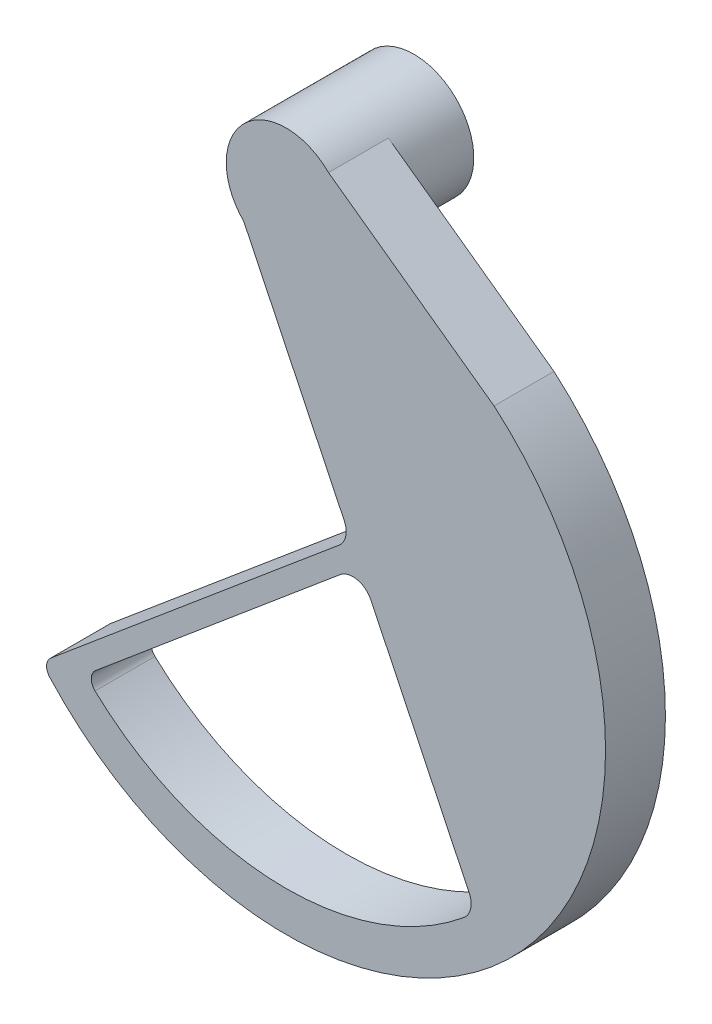
ISO-10303-21;
HEADER;
FILE_DESCRIPTION(('STEP AP214'),'2;1');
FILE_NAME('part.step','',(''),(''),'','','');
FILE_SCHEMA(('AUTOMOTIVE_DESIGN { 1 0 10303 214 1 1 1 1 }'));
ENDSEC;
DATA;
#1=APPLICATION_CONTEXT('core data for automotive mechanical design processes');
#2=APPLICATION_PROTOCOL_DEFINITION('international standard','automotive_design',2000,#1);
#3=PRODUCT_CONTEXT('',#1,'mechanical');
#4=PRODUCT('Part','Part','',(#3));
#5=PRODUCT_RELATED_PRODUCT_CATEGORY('part','',(#4));
#6=PRODUCT_DEFINITION_FORMATION('','',#4);
#7=PRODUCT_DEFINITION_CONTEXT('part definition',#1,'design');
#8=PRODUCT_DEFINITION('design','',#6,#7);
#9=PRODUCT_DEFINITION_SHAPE('','',#8);
#10=(LENGTH_UNIT() NAMED_UNIT(*) SI_UNIT(.MILLI.,.METRE.));
#11=(NAMED_UNIT(*) PLANE_ANGLE_UNIT() SI_UNIT($,.RADIAN.));
#12=(NAMED_UNIT(*) SI_UNIT($,.STERADIAN.) SOLID_ANGLE_UNIT());
#13=UNCERTAINTY_MEASURE_WITH_UNIT(LENGTH_MEASURE(1.E-05),#10,'distance_accuracy_value','');
#14=(GEOMETRIC_REPRESENTATION_CONTEXT(3) GLOBAL_UNCERTAINTY_ASSIGNED_CONTEXT((#13)) GLOBAL_UNIT_ASSIGNED_CONTEXT((#10,
#11,#12)) REPRESENTATION_CONTEXT('',''));
#15=CARTESIAN_POINT('',(0.,0.,0.));
#16=DIRECTION('',(0.,0.,1.));
#17=DIRECTION('',(1.,0.,0.));
#18=AXIS2_PLACEMENT_3D('',#15,#16,#17);
#19=CARTESIAN_POINT('',(0.,0.,0.));
#20=DIRECTION('',(0.,0.,1.));
#21=DIRECTION('',(1.,0.,0.));
#22=AXIS2_PLACEMENT_3D('',#19,#20,#21);
#23=PLANE('',#22);
#24=DIRECTION('',(0.433389731511241,-0.901206602628173,0.));
#25=VECTOR('',#24,1.);
#26=CARTESIAN_POINT('',(-12.7570586950624,-6.1348621133076,0.));
#27=LINE('',#26,#25);
#28=CARTESIAN_POINT('',(21.2324006956412,-76.8137984043253,0.));
#29=VERTEX_POINT('',#28);
#30=CARTESIAN_POINT('',(45.844843506453,-127.9938203457,0.));
#31=VERTEX_POINT('',#30);
#32=EDGE_CURVE('E180',#29,#31,#27,.T.);
#33=ORIENTED_EDGE('',*,*,#32,.F.);
#34=CARTESIAN_POINT('',(16.7263676825004,-78.9807470618814,0.));
#35=DIRECTION('',(0.,0.,1.));
#36=DIRECTION('',(1.,0.,0.));
#37=AXIS2_PLACEMENT_3D('',#34,#35,#36);
#38=CIRCLE('',#37,5.);
#39=CARTESIAN_POINT('',(13.5112294647628,-75.1515322284145,0.));
#40=VERTEX_POINT('',#39);
#41=EDGE_CURVE('E104',#40,#29,#38,.F.);
#42=ORIENTED_EDGE('',*,*,#41,.F.);
#43=DIRECTION('',(0.765842966693394,0.643027643547508,0.));
#44=VECTOR('',#43,1.);
#45=CARTESIAN_POINT('',(42.5956727933285,-50.7312504333006,0.));
#46=LINE('',#45,#44);
#47=CARTESIAN_POINT('',(-47.7476784165524,-126.586582094174,0.));
#48=VERTEX_POINT('',#47);
#49=EDGE_CURVE('E98',#48,#40,#46,.T.);
#50=ORIENTED_EDGE('',*,*,#49,.F.);
#51=CARTESIAN_POINT('',(-45.8185954859101,-128.884110994254,0.));
#52=DIRECTION('',(0.,0.,1.));
#53=DIRECTION('',(1.,0.,0.));
#54=AXIS2_PLACEMENT_3D('',#51,#52,#53);
#55=CIRCLE('',#54,2.99999999999979);
#56=CARTESIAN_POINT('',(-47.870174388264,-131.072951785042,0.));
#57=VERTEX_POINT('',#56);
#58=EDGE_CURVE('E156',#57,#48,#55,.F.);
#59=ORIENTED_EDGE('',*,*,#58,.F.);
#60=CARTESIAN_POINT('',(0.,-80.,0.));
#61=DIRECTION('',(0.,0.,1.));
#62=DIRECTION('',(1.,0.,0.));
#63=AXIS2_PLACEMENT_3D('',#60,#61,#62);
#64=CIRCLE('',#63,70.);
#65=CARTESIAN_POINT('',(44.5187189927976,-134.019289695814,0.));
#66=VERTEX_POINT('',#65);
#67=EDGE_CURVE('E187',#57,#66,#64,.T.);
#68=ORIENTED_EDGE('',*,*,#67,.T.);
#69=CARTESIAN_POINT('',(41.3388104933121,-130.160769003256,0.));
#70=DIRECTION('',(0.,0.,1.));
#71=DIRECTION('',(1.,0.,0.));
#72=AXIS2_PLACEMENT_3D('',#69,#70,#71);
#73=CIRCLE('',#72,4.99999999999999);
#74=EDGE_CURVE('E183',#31,#66,#73,.F.);
#75=ORIENTED_EDGE('',*,*,#74,.F.);
#76=EDGE_LOOP('',(#33,#42,#50,#59,#68,#75));
#77=FACE_BOUND('',#76,.T.);
#78=CARTESIAN_POINT('',(0.,0.,0.));
#79=DIRECTION('',(0.,0.,-1.));
#80=DIRECTION('',(-1.,0.,0.));
#81=AXIS2_PLACEMENT_3D('',#78,#79,#80);
#82=CIRCLE('',#81,15.);
#83=CARTESIAN_POINT('',(10.6066017177981,10.6066017177983,0.));
#84=VERTEX_POINT('',#83);
#85=CARTESIAN_POINT('',(-10.6066017177981,-10.6066017177983,0.));
#86=VERTEX_POINT('',#85);
#87=EDGE_CURVE('E213',#84,#86,#82,.T.);
#88=ORIENTED_EDGE('',*,*,#87,.F.);
#89=DIRECTION('',(0.811357931424902,-0.584549661802916,0.));
#90=VECTOR('',#89,1.);
#91=CARTESIAN_POINT('',(8.65474635415258,12.0128323695447,0.));
#92=LINE('',#91,#90);
#93=CARTESIAN_POINT('',(52.0761789176771,-19.2705047828151,0.));
#94=VERTEX_POINT('',#93);
#95=EDGE_CURVE('E179',#84,#94,#92,.T.);
#96=ORIENTED_EDGE('',*,*,#95,.T.);
#97=CARTESIAN_POINT('',(0.,-80.,0.));
#98=DIRECTION('',(0.,0.,1.));
#99=DIRECTION('',(1.,0.,0.));
#100=AXIS2_PLACEMENT_3D('',#97,#98,#99);
#101=CIRCLE('',#100,80.);
#102=CARTESIAN_POINT('',(-59.2335308651964,-133.771635843089,0.));
#103=VERTEX_POINT('',#102);
#104=EDGE_CURVE('E176',#103,#94,#101,.T.);
#105=ORIENTED_EDGE('',*,*,#104,.F.);
#106=CARTESIAN_POINT('',(-57.0122734577518,-131.755199498973,0.));
#107=DIRECTION('',(0.,0.,1.));
#108=DIRECTION('',(1.,0.,0.));
#109=AXIS2_PLACEMENT_3D('',#106,#107,#108);
#110=CIRCLE('',#109,2.99999999999976);
#111=CARTESIAN_POINT('',(-58.9406362868111,-129.457066169617,0.));
#112=VERTEX_POINT('',#111);
#113=EDGE_CURVE('E173',#103,#112,#110,.F.);
#114=ORIENTED_EDGE('',*,*,#113,.T.);
#115=DIRECTION('',(0.766044443118982,0.642787609686534,0.));
#116=VECTOR('',#115,1.);
#117=CARTESIAN_POINT('',(39.3923101204882,-46.9459271066778,0.));
#118=LINE('',#117,#116);
#119=CARTESIAN_POINT('',(13.2441851892925,-68.8868090924212,0.));
#120=VERTEX_POINT('',#119);
#121=EDGE_CURVE('E169',#112,#120,#118,.T.);
#122=ORIENTED_EDGE('',*,*,#121,.T.);
#123=CARTESIAN_POINT('',(10.0302471408598,-65.0565868768263,0.));
#124=DIRECTION('',(0.,0.,1.));
#125=DIRECTION('',(1.,0.,0.));
#126=AXIS2_PLACEMENT_3D('',#123,#124,#125);
#127=CIRCLE('',#126,5.);
#128=CARTESIAN_POINT('',(14.5362801540007,-62.8896382192701,0.));
#129=VERTEX_POINT('',#128);
#130=EDGE_CURVE('E166',#120,#129,#127,.T.);
#131=ORIENTED_EDGE('',*,*,#130,.T.);
#132=DIRECTION('',(0.433389731511242,-0.901206602628173,0.));
#133=VECTOR('',#132,1.);
#134=CARTESIAN_POINT('',(-12.7570586950624,-6.13486211330761,0.));
#135=LINE('',#134,#133);
#136=EDGE_CURVE('E184',#86,#129,#135,.T.);
#137=ORIENTED_EDGE('',*,*,#136,.F.);
#138=EDGE_LOOP('',(#88,#96,#105,#114,#122,#131,#137));
#139=FACE_BOUND('',#138,.T.);
#140=ADVANCED_FACE('F37',(#77,#139),#23,.F.);
#141=CARTESIAN_POINT('',(-12.7570586950624,-6.1348621133076,15.));
#142=DIRECTION('',(0.901206602628173,0.433389731511241,0.));
#143=DIRECTION('',(-0.433389731511241,0.901206602628173,0.));
#144=AXIS2_PLACEMENT_3D('',#141,#142,#143);
#145=PLANE('',#144);
#146=ORIENTED_EDGE('',*,*,#32,.T.);
#147=DIRECTION('',(0.,0.,-1.));
#148=VECTOR('',#147,1.);
#149=CARTESIAN_POINT('',(45.844843506453,-127.9938203457,15.));
#150=LINE('',#149,#148);
#151=CARTESIAN_POINT('',(45.844843506453,-127.9938203457,15.));
#152=VERTEX_POINT('',#151);
#153=EDGE_CURVE('E11',#152,#31,#150,.T.);
#154=ORIENTED_EDGE('',*,*,#153,.F.);
#155=DIRECTION('',(0.433389731511241,-0.901206602628173,0.));
#156=VECTOR('',#155,1.);
#157=CARTESIAN_POINT('',(-12.7570586950624,-6.1348621133076,15.));
#158=LINE('',#157,#156);
#159=CARTESIAN_POINT('',(21.2324006956412,-76.8137984043253,15.));
#160=VERTEX_POINT('',#159);
#161=EDGE_CURVE('E234',#160,#152,#158,.T.);
#162=ORIENTED_EDGE('',*,*,#161,.F.);
#163=DIRECTION('',(0.,0.,-1.));
#164=VECTOR('',#163,1.);
#165=CARTESIAN_POINT('',(21.2324006956412,-76.8137984043253,15.));
#166=LINE('',#165,#164);
#167=EDGE_CURVE('E194',#160,#29,#166,.T.);
#168=ORIENTED_EDGE('',*,*,#167,.T.);
#169=EDGE_LOOP('',(#146,#154,#162,#168));
#170=FACE_BOUND('',#169,.T.);
#171=ADVANCED_FACE('F246',(#170),#145,.F.);
#172=CARTESIAN_POINT('',(41.3388104933121,-130.160769003256,15.));
#173=DIRECTION('',(0.,0.,-1.));
#174=DIRECTION('',(-1.,0.,0.));
#175=AXIS2_PLACEMENT_3D('',#172,#173,#174);
#176=CYLINDRICAL_SURFACE('',#175,4.99999999999999);
#177=ORIENTED_EDGE('',*,*,#74,.T.);
#178=DIRECTION('',(0.,0.,-1.));
#179=VECTOR('',#178,1.);
#180=CARTESIAN_POINT('',(44.5187189927976,-134.019289695814,15.));
#181=LINE('',#180,#179);
#182=CARTESIAN_POINT('',(44.5187189927976,-134.019289695814,15.));
#183=VERTEX_POINT('',#182);
#184=EDGE_CURVE('E47',#183,#66,#181,.T.);
#185=ORIENTED_EDGE('',*,*,#184,.F.);
#186=CARTESIAN_POINT('',(41.3388104933121,-130.160769003256,15.));
#187=DIRECTION('',(0.,0.,1.));
#188=DIRECTION('',(1.,0.,0.));
#189=AXIS2_PLACEMENT_3D('',#186,#187,#188);
#190=CIRCLE('',#189,4.99999999999999);
#191=EDGE_CURVE('E236',#152,#183,#190,.F.);
#192=ORIENTED_EDGE('',*,*,#191,.F.);
#193=ORIENTED_EDGE('',*,*,#153,.T.);
#194=EDGE_LOOP('',(#177,#185,#192,#193));
#195=FACE_BOUND('',#194,.T.);
#196=ADVANCED_FACE('F268',(#195),#176,.F.);
#197=CARTESIAN_POINT('',(0.,-80.,15.));
#198=DIRECTION('',(0.,0.,-1.));
#199=DIRECTION('',(-1.,0.,0.));
#200=AXIS2_PLACEMENT_3D('',#197,#198,#199);
#201=CYLINDRICAL_SURFACE('',#200,70.);
#202=ORIENTED_EDGE('',*,*,#67,.F.);
#203=DIRECTION('',(0.,0.,-1.));
#204=VECTOR('',#203,1.);
#205=CARTESIAN_POINT('',(-47.870174388264,-131.072951785042,15.));
#206=LINE('',#205,#204);
#207=CARTESIAN_POINT('',(-47.870174388264,-131.072951785042,15.));
#208=VERTEX_POINT('',#207);
#209=EDGE_CURVE('E157',#208,#57,#206,.T.);
#210=ORIENTED_EDGE('',*,*,#209,.F.);
#211=CARTESIAN_POINT('',(0.,-80.,15.));
#212=DIRECTION('',(0.,0.,1.));
#213=DIRECTION('',(1.,0.,0.));
#214=AXIS2_PLACEMENT_3D('',#211,#212,#213);
#215=CIRCLE('',#214,70.);
#216=EDGE_CURVE('E150',#208,#183,#215,.T.);
#217=ORIENTED_EDGE('',*,*,#216,.T.);
#218=ORIENTED_EDGE('',*,*,#184,.T.);
#219=EDGE_LOOP('',(#202,#210,#217,#218));
#220=FACE_BOUND('',#219,.T.);
#221=ADVANCED_FACE('F239',(#220),#201,.F.);
#222=CARTESIAN_POINT('',(-45.8185954859101,-128.884110994254,15.));
#223=DIRECTION('',(0.,0.,-1.));
#224=DIRECTION('',(-1.,0.,0.));
#225=AXIS2_PLACEMENT_3D('',#222,#223,#224);
#226=CYLINDRICAL_SURFACE('',#225,2.99999999999979);
#227=ORIENTED_EDGE('',*,*,#58,.T.);
#228=DIRECTION('',(0.,0.,-1.));
#229=VECTOR('',#228,1.);
#230=CARTESIAN_POINT('',(-47.7476784165524,-126.586582094174,15.));
#231=LINE('',#230,#229);
#232=CARTESIAN_POINT('',(-47.7476784165524,-126.586582094174,15.));
#233=VERTEX_POINT('',#232);
#234=EDGE_CURVE('E153',#233,#48,#231,.T.);
#235=ORIENTED_EDGE('',*,*,#234,.F.);
#236=CARTESIAN_POINT('',(-45.8185954859101,-128.884110994254,15.));
#237=DIRECTION('',(0.,0.,1.));
#238=DIRECTION('',(1.,0.,0.));
#239=AXIS2_PLACEMENT_3D('',#236,#237,#238);
#240=CIRCLE('',#239,2.99999999999979);
#241=EDGE_CURVE('E144',#208,#233,#240,.F.);
#242=ORIENTED_EDGE('',*,*,#241,.F.);
#243=ORIENTED_EDGE('',*,*,#209,.T.);
#244=EDGE_LOOP('',(#227,#235,#242,#243));
#245=FACE_BOUND('',#244,.T.);
#246=ADVANCED_FACE('F154',(#245),#226,.F.);
#247=CARTESIAN_POINT('',(42.5956727933285,-50.7312504333006,15.));
#248=DIRECTION('',(-0.643027643547508,0.765842966693394,0.));
#249=DIRECTION('',(-0.765842966693394,-0.643027643547508,0.));
#250=AXIS2_PLACEMENT_3D('',#247,#248,#249);
#251=PLANE('',#250);
#252=ORIENTED_EDGE('',*,*,#49,.T.);
#253=DIRECTION('',(0.,0.,-1.));
#254=VECTOR('',#253,1.);
#255=CARTESIAN_POINT('',(13.5112294647628,-75.1515322284145,15.));
#256=LINE('',#255,#254);
#257=CARTESIAN_POINT('',(13.5112294647628,-75.1515322284145,15.));
#258=VERTEX_POINT('',#257);
#259=EDGE_CURVE('E158',#258,#40,#256,.T.);
#260=ORIENTED_EDGE('',*,*,#259,.F.);
#261=DIRECTION('',(0.765842966693394,0.643027643547508,0.));
#262=VECTOR('',#261,1.);
#263=CARTESIAN_POINT('',(42.5956727933285,-50.7312504333006,15.));
#264=LINE('',#263,#262);
#265=EDGE_CURVE('E148',#233,#258,#264,.T.);
#266=ORIENTED_EDGE('',*,*,#265,.F.);
#267=ORIENTED_EDGE('',*,*,#234,.T.);
#268=EDGE_LOOP('',(#252,#260,#266,#267));
#269=FACE_BOUND('',#268,.T.);
#270=ADVANCED_FACE('F160',(#269),#251,.F.);
#271=CARTESIAN_POINT('',(10.0302471408598,-65.0565868768263,15.));
#272=DIRECTION('',(0.,0.,-1.));
#273=DIRECTION('',(-1.,0.,0.));
#274=AXIS2_PLACEMENT_3D('',#271,#272,#273);
#275=CYLINDRICAL_SURFACE('',#274,5.);
#276=ORIENTED_EDGE('',*,*,#130,.F.);
#277=DIRECTION('',(0.,0.,-1.));
#278=VECTOR('',#277,1.);
#279=CARTESIAN_POINT('',(13.2441851892925,-68.8868090924212,15.));
#280=LINE('',#279,#278);
#281=CARTESIAN_POINT('',(13.2441851892925,-68.8868090924212,15.));
#282=VERTEX_POINT('',#281);
#283=EDGE_CURVE('E112',#282,#120,#280,.T.);
#284=ORIENTED_EDGE('',*,*,#283,.F.);
#285=CARTESIAN_POINT('',(10.0302471408598,-65.0565868768263,15.));
#286=DIRECTION('',(0.,0.,1.));
#287=DIRECTION('',(1.,0.,0.));
#288=AXIS2_PLACEMENT_3D('',#285,#286,#287);
#289=CIRCLE('',#288,5.);
#290=CARTESIAN_POINT('',(14.5362801540007,-62.8896382192701,15.));
#291=VERTEX_POINT('',#290);
#292=EDGE_CURVE('E193',#282,#291,#289,.T.);
#293=ORIENTED_EDGE('',*,*,#292,.T.);
#294=DIRECTION('',(0.,0.,-1.));
#295=VECTOR('',#294,1.);
#296=CARTESIAN_POINT('',(14.5362801540007,-62.8896382192701,15.));
#297=LINE('',#296,#295);
#298=EDGE_CURVE('E162',#291,#129,#297,.T.);
#299=ORIENTED_EDGE('',*,*,#298,.T.);
#300=EDGE_LOOP('',(#276,#284,#293,#299));
#301=FACE_BOUND('',#300,.T.);
#302=ADVANCED_FACE('F39',(#301),#275,.F.);
#303=CARTESIAN_POINT('',(39.3923101204882,-46.9459271066778,15.));
#304=DIRECTION('',(-0.642787609686534,0.766044443118983,0.));
#305=DIRECTION('',(-0.766044443118982,-0.642787609686534,0.));
#306=AXIS2_PLACEMENT_3D('',#303,#304,#305);
#307=PLANE('',#306);
#308=ORIENTED_EDGE('',*,*,#121,.F.);
#309=DIRECTION('',(0.,0.,-1.));
#310=VECTOR('',#309,1.);
#311=CARTESIAN_POINT('',(-58.9406362868111,-129.457066169617,15.));
#312=LINE('',#311,#310);
#313=CARTESIAN_POINT('',(-58.9406362868111,-129.457066169617,15.));
#314=VERTEX_POINT('',#313);
#315=EDGE_CURVE('E206',#314,#112,#312,.T.);
#316=ORIENTED_EDGE('',*,*,#315,.F.);
#317=DIRECTION('',(0.766044443118982,0.642787609686534,0.));
#318=VECTOR('',#317,1.);
#319=CARTESIAN_POINT('',(39.3923101204882,-46.9459271066778,15.));
#320=LINE('',#319,#318);
#321=EDGE_CURVE('E219',#314,#282,#320,.T.);
#322=ORIENTED_EDGE('',*,*,#321,.T.);
#323=ORIENTED_EDGE('',*,*,#283,.T.);
#324=EDGE_LOOP('',(#308,#316,#322,#323));
#325=FACE_BOUND('',#324,.T.);
#326=ADVANCED_FACE('F311',(#325),#307,.T.);
#327=CARTESIAN_POINT('',(-57.0122734577518,-131.755199498973,15.));
#328=DIRECTION('',(0.,0.,-1.));
#329=DIRECTION('',(-1.,0.,0.));
#330=AXIS2_PLACEMENT_3D('',#327,#328,#329);
#331=CYLINDRICAL_SURFACE('',#330,2.99999999999976);
#332=ORIENTED_EDGE('',*,*,#113,.F.);
#333=DIRECTION('',(0.,0.,-1.));
#334=VECTOR('',#333,1.);
#335=CARTESIAN_POINT('',(-59.2335308651964,-133.771635843089,15.));
#336=LINE('',#335,#334);
#337=CARTESIAN_POINT('',(-59.2335308651964,-133.771635843089,15.));
#338=VERTEX_POINT('',#337);
#339=EDGE_CURVE('E203',#338,#103,#336,.T.);
#340=ORIENTED_EDGE('',*,*,#339,.F.);
#341=CARTESIAN_POINT('',(-57.0122734577518,-131.755199498973,15.));
#342=DIRECTION('',(0.,0.,1.));
#343=DIRECTION('',(1.,0.,0.));
#344=AXIS2_PLACEMENT_3D('',#341,#342,#343);
#345=CIRCLE('',#344,2.99999999999976);
#346=EDGE_CURVE('E222',#338,#314,#345,.F.);
#347=ORIENTED_EDGE('',*,*,#346,.T.);
#348=ORIENTED_EDGE('',*,*,#315,.T.);
#349=EDGE_LOOP('',(#332,#340,#347,#348));
#350=FACE_BOUND('',#349,.T.);
#351=ADVANCED_FACE('F308',(#350),#331,.T.);
#352=CARTESIAN_POINT('',(0.,-80.,15.));
#353=DIRECTION('',(0.,0.,-1.));
#354=DIRECTION('',(-1.,0.,0.));
#355=AXIS2_PLACEMENT_3D('',#352,#353,#354);
#356=CYLINDRICAL_SURFACE('',#355,80.);
#357=ORIENTED_EDGE('',*,*,#104,.T.);
#358=DIRECTION('',(0.,0.,-1.));
#359=VECTOR('',#358,1.);
#360=CARTESIAN_POINT('',(52.0761789176771,-19.2705047828151,15.));
#361=LINE('',#360,#359);
#362=CARTESIAN_POINT('',(52.0761789176771,-19.2705047828151,15.));
#363=VERTEX_POINT('',#362);
#364=EDGE_CURVE('E201',#363,#94,#361,.T.);
#365=ORIENTED_EDGE('',*,*,#364,.F.);
#366=CARTESIAN_POINT('',(0.,-80.,15.));
#367=DIRECTION('',(0.,0.,1.));
#368=DIRECTION('',(1.,0.,0.));
#369=AXIS2_PLACEMENT_3D('',#366,#367,#368);
#370=CIRCLE('',#369,80.);
#371=EDGE_CURVE('E225',#338,#363,#370,.T.);
#372=ORIENTED_EDGE('',*,*,#371,.F.);
#373=ORIENTED_EDGE('',*,*,#339,.T.);
#374=EDGE_LOOP('',(#357,#365,#372,#373));
#375=FACE_BOUND('',#374,.T.);
#376=ADVANCED_FACE('F301',(#375),#356,.T.);
#377=CARTESIAN_POINT('',(8.65474635415258,12.0128323695447,15.));
#378=DIRECTION('',(0.584549661802916,0.811357931424902,0.));
#379=DIRECTION('',(-0.811357931424902,0.584549661802916,0.));
#380=AXIS2_PLACEMENT_3D('',#377,#378,#379);
#381=PLANE('',#380);
#382=ORIENTED_EDGE('',*,*,#95,.F.);
#383=DIRECTION('',(0.,0.,-1.));
#384=VECTOR('',#383,1.);
#385=CARTESIAN_POINT('',(10.6066017177981,10.6066017177983,15.));
#386=LINE('',#385,#384);
#387=CARTESIAN_POINT('',(10.6066017177981,10.6066017177983,15.));
#388=VERTEX_POINT('',#387);
#389=EDGE_CURVE('E204',#388,#84,#386,.T.);
#390=ORIENTED_EDGE('',*,*,#389,.F.);
#391=DIRECTION('',(0.811357931424902,-0.584549661802916,0.));
#392=VECTOR('',#391,1.);
#393=CARTESIAN_POINT('',(8.65474635415258,12.0128323695447,15.));
#394=LINE('',#393,#392);
#395=EDGE_CURVE('E227',#388,#363,#394,.T.);
#396=ORIENTED_EDGE('',*,*,#395,.T.);
#397=ORIENTED_EDGE('',*,*,#364,.T.);
#398=EDGE_LOOP('',(#382,#390,#396,#397));
#399=FACE_BOUND('',#398,.T.);
#400=ADVANCED_FACE('F295',(#399),#381,.T.);
#401=CARTESIAN_POINT('',(0.,0.,15.));
#402=DIRECTION('',(0.,0.,-1.));
#403=DIRECTION('',(-1.,0.,0.));
#404=AXIS2_PLACEMENT_3D('',#401,#402,#403);
#405=CYLINDRICAL_SURFACE('',#404,15.);
#406=ORIENTED_EDGE('',*,*,#389,.T.);
#407=ORIENTED_EDGE('',*,*,#87,.T.);
#408=DIRECTION('',(0.,0.,-1.));
#409=VECTOR('',#408,1.);
#410=CARTESIAN_POINT('',(-10.6066017177981,-10.6066017177983,15.));
#411=LINE('',#410,#409);
#412=CARTESIAN_POINT('',(-10.6066017177981,-10.6066017177983,15.));
#413=VERTEX_POINT('',#412);
#414=EDGE_CURVE('E200',#413,#86,#411,.T.);
#415=ORIENTED_EDGE('',*,*,#414,.F.);
#416=CARTESIAN_POINT('',(0.,0.,15.));
#417=DIRECTION('',(0.,0.,1.));
#418=DIRECTION('',(1.,0.,0.));
#419=AXIS2_PLACEMENT_3D('',#416,#417,#418);
#420=CIRCLE('',#419,15.);
#421=EDGE_CURVE('E230',#388,#413,#420,.T.);
#422=ORIENTED_EDGE('',*,*,#421,.F.);
#423=EDGE_LOOP('',(#406,#407,#415,#422));
#424=FACE_BOUND('',#423,.T.);
#425=CARTESIAN_POINT('',(0.,0.,-17.));
#426=DIRECTION('',(0.,0.,-1.));
#427=DIRECTION('',(-1.,0.,0.));
#428=AXIS2_PLACEMENT_3D('',#425,#426,#427);
#429=CIRCLE('',#428,15.);
#430=CARTESIAN_POINT('',(-15.,0.,-17.));
#431=VERTEX_POINT('',#430);
#432=EDGE_CURVE('E170',#431,#431,#429,.T.);
#433=ORIENTED_EDGE('',*,*,#432,.F.);
#434=EDGE_LOOP('',(#433));
#435=FACE_BOUND('',#434,.T.);
#436=ADVANCED_FACE('F259',(#424,#435),#405,.T.);
#437=CARTESIAN_POINT('',(-12.7570586950624,-6.13486211330761,15.));
#438=DIRECTION('',(0.901206602628173,0.433389731511242,0.));
#439=DIRECTION('',(-0.433389731511242,0.901206602628173,0.));
#440=AXIS2_PLACEMENT_3D('',#437,#438,#439);
#441=PLANE('',#440);
#442=ORIENTED_EDGE('',*,*,#136,.T.);
#443=ORIENTED_EDGE('',*,*,#298,.F.);
#444=DIRECTION('',(0.433389731511242,-0.901206602628173,0.));
#445=VECTOR('',#444,1.);
#446=CARTESIAN_POINT('',(-12.7570586950624,-6.13486211330761,15.));
#447=LINE('',#446,#445);
#448=EDGE_CURVE('E232',#413,#291,#447,.T.);
#449=ORIENTED_EDGE('',*,*,#448,.F.);
#450=ORIENTED_EDGE('',*,*,#414,.T.);
#451=EDGE_LOOP('',(#442,#443,#449,#450));
#452=FACE_BOUND('',#451,.T.);
#453=ADVANCED_FACE('F250',(#452),#441,.F.);
#454=CARTESIAN_POINT('',(16.7263676825004,-78.9807470618814,15.));
#455=DIRECTION('',(0.,0.,-1.));
#456=DIRECTION('',(-1.,0.,0.));
#457=AXIS2_PLACEMENT_3D('',#454,#455,#456);
#458=CYLINDRICAL_SURFACE('',#457,5.);
#459=ORIENTED_EDGE('',*,*,#41,.T.);
#460=ORIENTED_EDGE('',*,*,#167,.F.);
#461=CARTESIAN_POINT('',(16.7263676825004,-78.9807470618814,15.));
#462=DIRECTION('',(0.,0.,1.));
#463=DIRECTION('',(1.,0.,0.));
#464=AXIS2_PLACEMENT_3D('',#461,#462,#463);
#465=CIRCLE('',#464,5.);
#466=EDGE_CURVE('E56',#258,#160,#465,.F.);
#467=ORIENTED_EDGE('',*,*,#466,.F.);
#468=ORIENTED_EDGE('',*,*,#259,.T.);
#469=EDGE_LOOP('',(#459,#460,#467,#468));
#470=FACE_BOUND('',#469,.T.);
#471=ADVANCED_FACE('F248',(#470),#458,.F.);
#472=CARTESIAN_POINT('',(0.,0.,15.));
#473=DIRECTION('',(0.,0.,1.));
#474=DIRECTION('',(1.,0.,0.));
#475=AXIS2_PLACEMENT_3D('',#472,#473,#474);
#476=PLANE('',#475);
#477=ORIENTED_EDGE('',*,*,#292,.F.);
#478=ORIENTED_EDGE('',*,*,#321,.F.);
#479=ORIENTED_EDGE('',*,*,#346,.F.);
#480=ORIENTED_EDGE('',*,*,#371,.T.);
#481=ORIENTED_EDGE('',*,*,#395,.F.);
#482=ORIENTED_EDGE('',*,*,#421,.T.);
#483=ORIENTED_EDGE('',*,*,#448,.T.);
#484=EDGE_LOOP('',(#477,#478,#479,#480,#481,#482,#483));
#485=FACE_BOUND('',#484,.T.);
#486=ORIENTED_EDGE('',*,*,#161,.T.);
#487=ORIENTED_EDGE('',*,*,#191,.T.);
#488=ORIENTED_EDGE('',*,*,#216,.F.);
#489=ORIENTED_EDGE('',*,*,#241,.T.);
#490=ORIENTED_EDGE('',*,*,#265,.T.);
#491=ORIENTED_EDGE('',*,*,#466,.T.);
#492=EDGE_LOOP('',(#486,#487,#488,#489,#490,#491));
#493=FACE_BOUND('',#492,.T.);
#494=ADVANCED_FACE('F146',(#485,#493),#476,.T.);
#495=CARTESIAN_POINT('',(0.,0.,-17.));
#496=DIRECTION('',(0.,0.,-1.));
#497=DIRECTION('',(-1.,0.,0.));
#498=AXIS2_PLACEMENT_3D('',#495,#496,#497);
#499=PLANE('',#498);
#500=CARTESIAN_POINT('',(0.,0.,-17.));
#501=DIRECTION('',(0.,0.,-1.));
#502=DIRECTION('',(-1.,0.,0.));
#503=AXIS2_PLACEMENT_3D('',#500,#501,#502);
#504=CIRCLE('',#503,10.);
#505=CARTESIAN_POINT('',(-10.,0.,-17.));
#506=VERTEX_POINT('',#505);
#507=EDGE_CURVE('E285',#506,#506,#504,.T.);
#508=ORIENTED_EDGE('',*,*,#507,.F.);
#509=EDGE_LOOP('',(#508));
#510=FACE_BOUND('',#509,.T.);
#511=ORIENTED_EDGE('',*,*,#432,.T.);
#512=EDGE_LOOP('',(#511));
#513=FACE_BOUND('',#512,.T.);
#514=ADVANCED_FACE('F256',(#510,#513),#499,.T.);
#515=CARTESIAN_POINT('',(0.,0.,-15.));
#516=DIRECTION('',(0.,0.,-1.));
#517=DIRECTION('',(-1.,0.,0.));
#518=AXIS2_PLACEMENT_3D('',#515,#516,#517);
#519=CYLINDRICAL_SURFACE('',#518,10.);
#520=CARTESIAN_POINT('',(0.,0.,-15.));
#521=DIRECTION('',(0.,0.,-1.));
#522=DIRECTION('',(-1.,0.,0.));
#523=AXIS2_PLACEMENT_3D('',#520,#521,#522);
#524=CIRCLE('',#523,10.);
#525=CARTESIAN_POINT('',(-10.,0.,-15.));
#526=VERTEX_POINT('',#525);
#527=EDGE_CURVE('E216',#526,#526,#524,.T.);
#528=ORIENTED_EDGE('',*,*,#527,.F.);
#529=EDGE_LOOP('',(#528));
#530=FACE_BOUND('',#529,.T.);
#531=ORIENTED_EDGE('',*,*,#507,.T.);
#532=EDGE_LOOP('',(#531));
#533=FACE_BOUND('',#532,.T.);
#534=ADVANCED_FACE('F273',(#530,#533),#519,.F.);
#535=CARTESIAN_POINT('',(0.,0.,-15.));
#536=DIRECTION('',(0.,0.,-1.));
#537=DIRECTION('',(-1.,0.,0.));
#538=AXIS2_PLACEMENT_3D('',#535,#536,#537);
#539=PLANE('',#538);
#540=ORIENTED_EDGE('',*,*,#527,.T.);
#541=EDGE_LOOP('',(#540));
#542=FACE_BOUND('',#541,.T.);
#543=ADVANCED_FACE('F277',(#542),#539,.T.);
#544=CLOSED_SHELL('',(#140,#171,#196,#221,#246,#270,#302,#326,#351,#376,#400,#436,#453,#471,
#494,#514,#534,#543));
#545=MANIFOLD_SOLID_BREP('B2',#544);
#546=ADVANCED_BREP_SHAPE_REPRESENTATION('',(#18,#545),#14);
#547=SHAPE_DEFINITION_REPRESENTATION(#9,#546);
ENDSEC;
END-ISO-10303-21;
